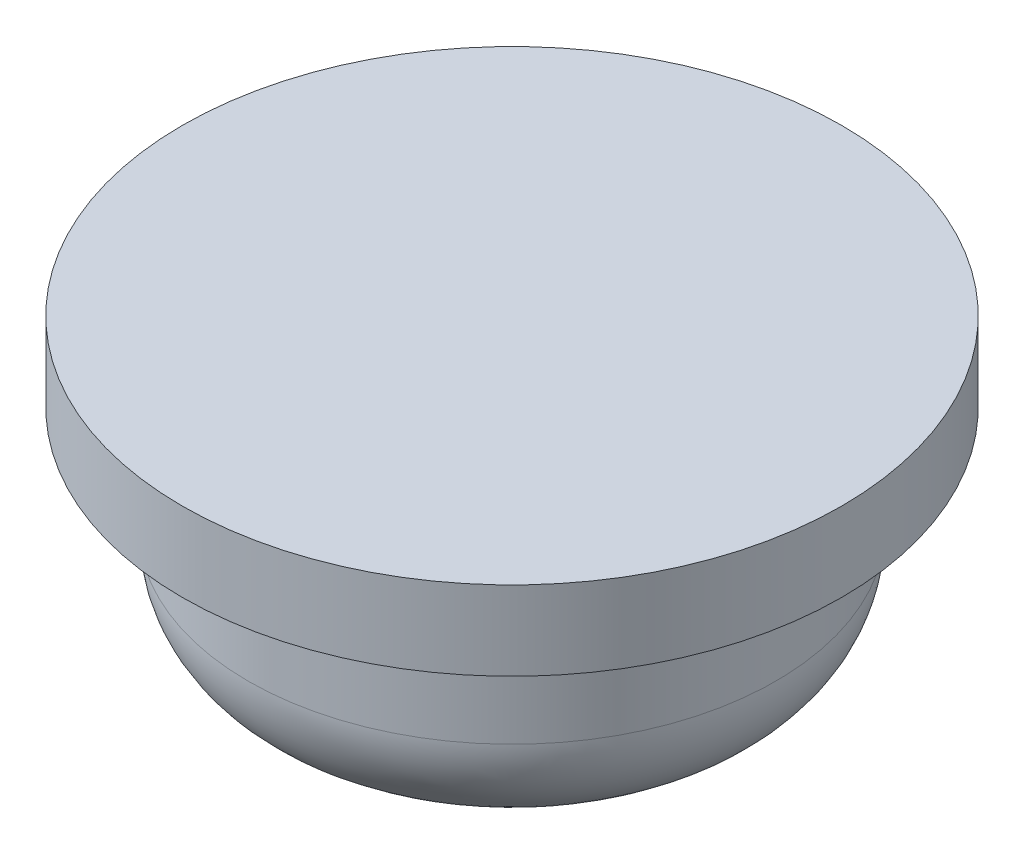
ISO-10303-21;
HEADER;
FILE_DESCRIPTION(('STEP AP214'),'2;1');
FILE_NAME('part.step','',(''),(''),'','','');
FILE_SCHEMA(('AUTOMOTIVE_DESIGN { 1 0 10303 214 1 1 1 1 }'));
ENDSEC;
DATA;
#1=APPLICATION_CONTEXT('core data for automotive mechanical design processes');
#2=APPLICATION_PROTOCOL_DEFINITION('international standard','automotive_design',2000,#1);
#3=PRODUCT_CONTEXT('',#1,'mechanical');
#4=PRODUCT('Part','Part','',(#3));
#5=PRODUCT_RELATED_PRODUCT_CATEGORY('part','',(#4));
#6=PRODUCT_DEFINITION_FORMATION('','',#4);
#7=PRODUCT_DEFINITION_CONTEXT('part definition',#1,'design');
#8=PRODUCT_DEFINITION('design','',#6,#7);
#9=PRODUCT_DEFINITION_SHAPE('','',#8);
#10=(LENGTH_UNIT() NAMED_UNIT(*) SI_UNIT(.MILLI.,.METRE.));
#11=(NAMED_UNIT(*) PLANE_ANGLE_UNIT() SI_UNIT($,.RADIAN.));
#12=(NAMED_UNIT(*) SI_UNIT($,.STERADIAN.) SOLID_ANGLE_UNIT());
#13=UNCERTAINTY_MEASURE_WITH_UNIT(LENGTH_MEASURE(1.E-05),#10,'distance_accuracy_value','');
#14=(GEOMETRIC_REPRESENTATION_CONTEXT(3) GLOBAL_UNCERTAINTY_ASSIGNED_CONTEXT((#13)) GLOBAL_UNIT_ASSIGNED_CONTEXT((#10,
#11,#12)) REPRESENTATION_CONTEXT('',''));
#15=CARTESIAN_POINT('',(0.,0.,0.));
#16=DIRECTION('',(0.,0.,1.));
#17=DIRECTION('',(1.,0.,0.));
#18=AXIS2_PLACEMENT_3D('',#15,#16,#17);
#19=CARTESIAN_POINT('',(0.,1.6,0.));
#20=DIRECTION('',(0.,-1.,0.));
#21=DIRECTION('',(0.,0.,-1.));
#22=AXIS2_PLACEMENT_3D('',#19,#20,#21);
#23=CYLINDRICAL_SURFACE('',#22,2.);
#24=CARTESIAN_POINT('',(0.,0.8,0.));
#25=DIRECTION('',(0.,1.,0.));
#26=DIRECTION('',(0.,0.,1.));
#27=AXIS2_PLACEMENT_3D('',#24,#25,#26);
#28=CIRCLE('',#27,2.);
#29=CARTESIAN_POINT('',(0.,0.8,2.));
#30=VERTEX_POINT('',#29);
#31=EDGE_CURVE('E40',#30,#30,#28,.T.);
#32=ORIENTED_EDGE('',*,*,#31,.T.);
#33=EDGE_LOOP('',(#32));
#34=FACE_BOUND('',#33,.T.);
#35=CARTESIAN_POINT('',(0.,1.6,0.));
#36=DIRECTION('',(0.,1.,0.));
#37=DIRECTION('',(0.,0.,1.));
#38=AXIS2_PLACEMENT_3D('',#35,#36,#37);
#39=CIRCLE('',#38,2.);
#40=CARTESIAN_POINT('',(0.,1.6,2.));
#41=VERTEX_POINT('',#40);
#42=EDGE_CURVE('E44',#41,#41,#39,.T.);
#43=ORIENTED_EDGE('',*,*,#42,.F.);
#44=EDGE_LOOP('',(#43));
#45=FACE_BOUND('',#44,.T.);
#46=ADVANCED_FACE('F33',(#34,#45),#23,.T.);
#47=CARTESIAN_POINT('',(0.,0.,0.));
#48=DIRECTION('',(0.,1.,0.));
#49=DIRECTION('',(0.,0.,1.));
#50=AXIS2_PLACEMENT_3D('',#47,#48,#49);
#51=PLANE('',#50);
#52=CARTESIAN_POINT('',(0.,0.,0.));
#53=DIRECTION('',(0.,1.,0.));
#54=DIRECTION('',(0.,0.,1.));
#55=AXIS2_PLACEMENT_3D('',#52,#53,#54);
#56=CIRCLE('',#55,1.2);
#57=CARTESIAN_POINT('',(0.,0.,1.2));
#58=VERTEX_POINT('',#57);
#59=EDGE_CURVE('E10',#58,#58,#56,.F.);
#60=ORIENTED_EDGE('',*,*,#59,.T.);
#61=EDGE_LOOP('',(#60));
#62=FACE_BOUND('',#61,.T.);
#63=ADVANCED_FACE('F62',(#62),#51,.F.);
#64=CARTESIAN_POINT('',(0.,2.2,0.));
#65=DIRECTION('',(0.,-1.,0.));
#66=DIRECTION('',(0.,0.,-1.));
#67=AXIS2_PLACEMENT_3D('',#64,#65,#66);
#68=CYLINDRICAL_SURFACE('',#67,2.5);
#69=CARTESIAN_POINT('',(0.,2.2,0.));
#70=DIRECTION('',(0.,1.,0.));
#71=DIRECTION('',(0.,0.,1.));
#72=AXIS2_PLACEMENT_3D('',#69,#70,#71);
#73=CIRCLE('',#72,2.5);
#74=CARTESIAN_POINT('',(0.,2.2,2.5));
#75=VERTEX_POINT('',#74);
#76=EDGE_CURVE('E48',#75,#75,#73,.T.);
#77=ORIENTED_EDGE('',*,*,#76,.F.);
#78=EDGE_LOOP('',(#77));
#79=FACE_BOUND('',#78,.T.);
#80=CARTESIAN_POINT('',(0.,1.6,0.));
#81=DIRECTION('',(0.,1.,0.));
#82=DIRECTION('',(0.,0.,1.));
#83=AXIS2_PLACEMENT_3D('',#80,#81,#82);
#84=CIRCLE('',#83,2.5);
#85=CARTESIAN_POINT('',(0.,1.6,2.5));
#86=VERTEX_POINT('',#85);
#87=EDGE_CURVE('E51',#86,#86,#84,.T.);
#88=ORIENTED_EDGE('',*,*,#87,.T.);
#89=EDGE_LOOP('',(#88));
#90=FACE_BOUND('',#89,.T.);
#91=ADVANCED_FACE('F59',(#79,#90),#68,.T.);
#92=CARTESIAN_POINT('',(0.,2.2,0.));
#93=DIRECTION('',(0.,1.,0.));
#94=DIRECTION('',(0.,0.,1.));
#95=AXIS2_PLACEMENT_3D('',#92,#93,#94);
#96=PLANE('',#95);
#97=ORIENTED_EDGE('',*,*,#76,.T.);
#98=EDGE_LOOP('',(#97));
#99=FACE_BOUND('',#98,.T.);
#100=ADVANCED_FACE('F57',(#99),#96,.T.);
#101=CARTESIAN_POINT('',(0.,1.6,0.));
#102=DIRECTION('',(0.,1.,0.));
#103=DIRECTION('',(0.,0.,1.));
#104=AXIS2_PLACEMENT_3D('',#101,#102,#103);
#105=PLANE('',#104);
#106=ORIENTED_EDGE('',*,*,#42,.T.);
#107=EDGE_LOOP('',(#106));
#108=FACE_BOUND('',#107,.T.);
#109=ORIENTED_EDGE('',*,*,#87,.F.);
#110=EDGE_LOOP('',(#109));
#111=FACE_BOUND('',#110,.T.);
#112=ADVANCED_FACE('F66',(#108,#111),#105,.F.);
#113=CARTESIAN_POINT('',(0.,0.8,0.));
#114=DIRECTION('',(0.,1.,0.));
#115=DIRECTION('',(0.,0.,1.));
#116=AXIS2_PLACEMENT_3D('',#113,#114,#115);
#117=TOROIDAL_SURFACE('',#116,1.2,0.8);
#118=ORIENTED_EDGE('',*,*,#59,.F.);
#119=EDGE_LOOP('',(#118));
#120=FACE_BOUND('',#119,.T.);
#121=ORIENTED_EDGE('',*,*,#31,.F.);
#122=EDGE_LOOP('',(#121));
#123=FACE_BOUND('',#122,.T.);
#124=ADVANCED_FACE('F35',(#120,#123),#117,.T.);
#125=CLOSED_SHELL('',(#46,#63,#91,#100,#112,#124));
#126=MANIFOLD_SOLID_BREP('B2',#125);
#127=ADVANCED_BREP_SHAPE_REPRESENTATION('',(#18,#126),#14);
#128=SHAPE_DEFINITION_REPRESENTATION(#9,#127);
ENDSEC;
END-ISO-10303-21;
